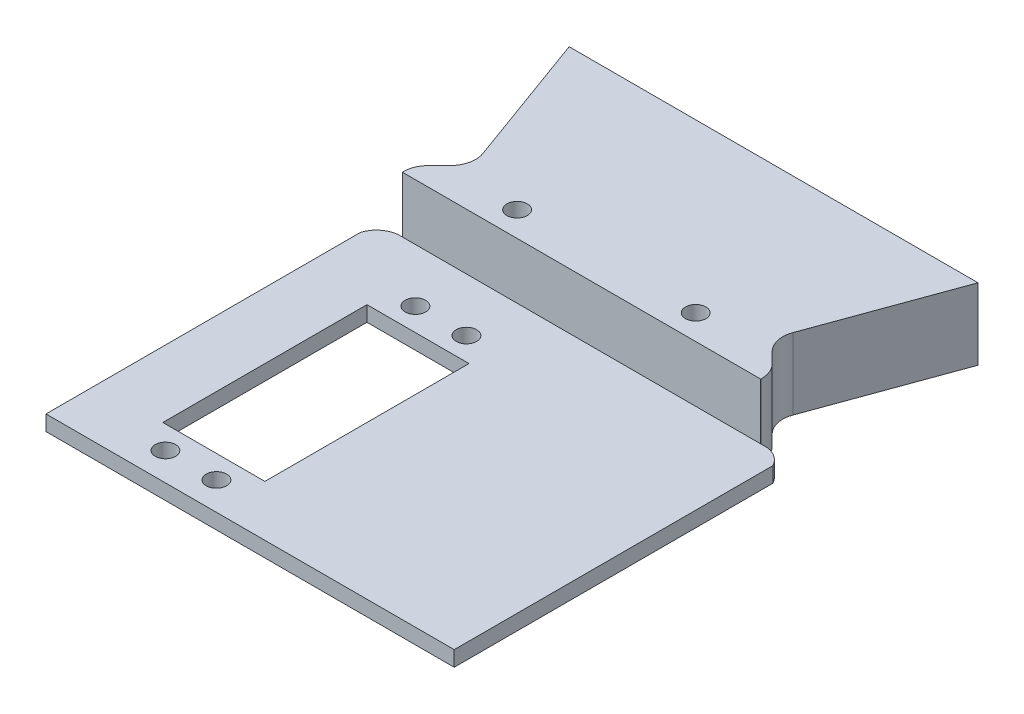
ISO-10303-21;
HEADER;
FILE_DESCRIPTION(('STEP AP214'),'2;1');
FILE_NAME('part.step','',(''),(''),'','','');
FILE_SCHEMA(('AUTOMOTIVE_DESIGN { 1 0 10303 214 1 1 1 1 }'));
ENDSEC;
DATA;
#1=APPLICATION_CONTEXT('core data for automotive mechanical design processes');
#2=APPLICATION_PROTOCOL_DEFINITION('international standard','automotive_design',2000,#1);
#3=PRODUCT_CONTEXT('',#1,'mechanical');
#4=PRODUCT('Part','Part','',(#3));
#5=PRODUCT_RELATED_PRODUCT_CATEGORY('part','',(#4));
#6=PRODUCT_DEFINITION_FORMATION('','',#4);
#7=PRODUCT_DEFINITION_CONTEXT('part definition',#1,'design');
#8=PRODUCT_DEFINITION('design','',#6,#7);
#9=PRODUCT_DEFINITION_SHAPE('','',#8);
#10=(LENGTH_UNIT() NAMED_UNIT(*) SI_UNIT(.MILLI.,.METRE.));
#11=(NAMED_UNIT(*) PLANE_ANGLE_UNIT() SI_UNIT($,.RADIAN.));
#12=(NAMED_UNIT(*) SI_UNIT($,.STERADIAN.) SOLID_ANGLE_UNIT());
#13=UNCERTAINTY_MEASURE_WITH_UNIT(LENGTH_MEASURE(1.E-05),#10,'distance_accuracy_value','');
#14=(GEOMETRIC_REPRESENTATION_CONTEXT(3) GLOBAL_UNCERTAINTY_ASSIGNED_CONTEXT((#13)) GLOBAL_UNIT_ASSIGNED_CONTEXT((#10,
#11,#12)) REPRESENTATION_CONTEXT('',''));
#15=CARTESIAN_POINT('',(0.,0.,0.));
#16=DIRECTION('',(0.,0.,1.));
#17=DIRECTION('',(1.,0.,0.));
#18=AXIS2_PLACEMENT_3D('',#15,#16,#17);
#19=CARTESIAN_POINT('',(30.122595971685,3.,4.7121872664304));
#20=DIRECTION('',(0.,1.,0.));
#21=DIRECTION('',(0.,0.,1.));
#22=AXIS2_PLACEMENT_3D('',#19,#20,#21);
#23=PLANE('',#22);
#24=CARTESIAN_POINT('',(-12.1,3.,64.3307254093344));
#25=DIRECTION('',(0.,1.,0.));
#26=DIRECTION('',(0.,0.,1.));
#27=AXIS2_PLACEMENT_3D('',#24,#25,#26);
#28=CIRCLE('',#27,2.);
#29=CARTESIAN_POINT('',(-12.1,3.,66.3307254093344));
#30=VERTEX_POINT('',#29);
#31=EDGE_CURVE('E498',#30,#30,#28,.F.);
#32=ORIENTED_EDGE('',*,*,#31,.T.);
#33=EDGE_LOOP('',(#32));
#34=FACE_BOUND('',#33,.T.);
#35=CARTESIAN_POINT('',(-22.1,3.,15.3307254093344));
#36=DIRECTION('',(0.,1.,0.));
#37=DIRECTION('',(0.,0.,1.));
#38=AXIS2_PLACEMENT_3D('',#35,#36,#37);
#39=CIRCLE('',#38,2.);
#40=CARTESIAN_POINT('',(-22.1,3.,17.3307254093344));
#41=VERTEX_POINT('',#40);
#42=EDGE_CURVE('E476',#41,#41,#39,.T.);
#43=ORIENTED_EDGE('',*,*,#42,.F.);
#44=EDGE_LOOP('',(#43));
#45=FACE_BOUND('',#44,.T.);
#46=DIRECTION('',(1.,0.,0.));
#47=VECTOR('',#46,1.);
#48=CARTESIAN_POINT('',(0.,3.,4.87726367456555));
#49=LINE('',#48,#47);
#50=CARTESIAN_POINT('',(-35.122595971685,3.,4.87726367456555));
#51=VERTEX_POINT('',#50);
#52=CARTESIAN_POINT('',(35.122595971685,3.,4.87726367456555));
#53=VERTEX_POINT('',#52);
#54=EDGE_CURVE('E256',#51,#53,#49,.T.);
#55=ORIENTED_EDGE('',*,*,#54,.F.);
#56=DIRECTION('',(-1.,0.,0.));
#57=VECTOR('',#56,1.);
#58=CARTESIAN_POINT('',(-40.,3.,4.87726367456555));
#59=LINE('',#58,#57);
#60=CARTESIAN_POINT('',(-35.8667204385013,3.,4.87726367456555));
#61=VERTEX_POINT('',#60);
#62=EDGE_CURVE('E355',#51,#61,#59,.T.);
#63=ORIENTED_EDGE('',*,*,#62,.T.);
#64=CARTESIAN_POINT('',(-35.4946582050931,3.,9.56251390208503));
#65=DIRECTION('',(0.,1.,0.));
#66=DIRECTION('',(0.,0.,1.));
#67=AXIS2_PLACEMENT_3D('',#64,#65,#66);
#68=CIRCLE('',#67,4.7);
#69=CARTESIAN_POINT('',(-40.,3.,8.2238969624547));
#70=VERTEX_POINT('',#69);
#71=EDGE_CURVE('E323',#61,#70,#68,.T.);
#72=ORIENTED_EDGE('',*,*,#71,.T.);
#73=DIRECTION('',(0.,0.,1.));
#74=VECTOR('',#73,1.);
#75=CARTESIAN_POINT('',(-40.,3.,36.0007254093344));
#76=LINE('',#75,#74);
#77=CARTESIAN_POINT('',(-40.,3.,69.8307254093344));
#78=VERTEX_POINT('',#77);
#79=EDGE_CURVE('E360',#70,#78,#76,.T.);
#80=ORIENTED_EDGE('',*,*,#79,.T.);
#81=DIRECTION('',(-1.,0.,0.));
#82=VECTOR('',#81,1.);
#83=CARTESIAN_POINT('',(-40.,3.,69.8307254093344));
#84=LINE('',#83,#82);
#85=CARTESIAN_POINT('',(40.002595971685,3.,69.8307254093344));
#86=VERTEX_POINT('',#85);
#87=EDGE_CURVE('E252',#86,#78,#84,.T.);
#88=ORIENTED_EDGE('',*,*,#87,.F.);
#89=DIRECTION('',(0.,0.,-1.));
#90=VECTOR('',#89,1.);
#91=CARTESIAN_POINT('',(40.002595971685,3.,4.87726367456555));
#92=LINE('',#91,#90);
#93=CARTESIAN_POINT('',(40.002595971685,3.,7.39589377408765));
#94=VERTEX_POINT('',#93);
#95=EDGE_CURVE('E351',#86,#94,#92,.T.);
#96=ORIENTED_EDGE('',*,*,#95,.T.);
#97=CARTESIAN_POINT('',(35.8131392673735,3.,9.5262581848634));
#98=DIRECTION('',(0.,1.,0.));
#99=DIRECTION('',(0.,0.,1.));
#100=AXIS2_PLACEMENT_3D('',#97,#98,#99);
#101=CIRCLE('',#100,4.7);
#102=CARTESIAN_POINT('',(36.5036825630621,3.,4.87726367456555));
#103=VERTEX_POINT('',#102);
#104=EDGE_CURVE('E341',#103,#94,#101,.F.);
#105=ORIENTED_EDGE('',*,*,#104,.F.);
#106=EDGE_CURVE('E359',#103,#53,#59,.T.);
#107=ORIENTED_EDGE('',*,*,#106,.T.);
#108=EDGE_LOOP('',(#55,#63,#72,#80,#88,#96,#105,#107));
#109=FACE_BOUND('',#108,.T.);
#110=DIRECTION('',(0.,0.,-1.));
#111=VECTOR('',#110,1.);
#112=CARTESIAN_POINT('',(-27.1,3.,0.));
#113=LINE('',#112,#111);
#114=CARTESIAN_POINT('',(-27.1,3.,59.8307254093344));
#115=VERTEX_POINT('',#114);
#116=CARTESIAN_POINT('',(-27.1,3.,19.8307254093344));
#117=VERTEX_POINT('',#116);
#118=EDGE_CURVE('E219',#115,#117,#113,.T.);
#119=ORIENTED_EDGE('',*,*,#118,.T.);
#120=DIRECTION('',(1.,0.,0.));
#121=VECTOR('',#120,1.);
#122=CARTESIAN_POINT('',(0.,3.,19.8307254093344));
#123=LINE('',#122,#121);
#124=CARTESIAN_POINT('',(-7.09999999999998,3.,19.8307254093344));
#125=VERTEX_POINT('',#124);
#126=EDGE_CURVE('E67',#117,#125,#123,.T.);
#127=ORIENTED_EDGE('',*,*,#126,.T.);
#128=DIRECTION('',(0.,0.,-1.));
#129=VECTOR('',#128,1.);
#130=CARTESIAN_POINT('',(-7.09999999999998,3.,0.));
#131=LINE('',#130,#129);
#132=CARTESIAN_POINT('',(-7.09999999999998,3.,59.8307254093344));
#133=VERTEX_POINT('',#132);
#134=EDGE_CURVE('E226',#133,#125,#131,.T.);
#135=ORIENTED_EDGE('',*,*,#134,.F.);
#136=DIRECTION('',(-1.,0.,0.));
#137=VECTOR('',#136,1.);
#138=CARTESIAN_POINT('',(8.3031811161835E-13,3.,59.830725409334));
#139=LINE('',#138,#137);
#140=EDGE_CURVE('E209',#133,#115,#139,.T.);
#141=ORIENTED_EDGE('',*,*,#140,.T.);
#142=EDGE_LOOP('',(#119,#127,#135,#141));
#143=FACE_BOUND('',#142,.T.);
#144=CARTESIAN_POINT('',(-22.1,3.,64.3307254093344));
#145=DIRECTION('',(0.,1.,0.));
#146=DIRECTION('',(0.,0.,1.));
#147=AXIS2_PLACEMENT_3D('',#144,#145,#146);
#148=CIRCLE('',#147,2.);
#149=CARTESIAN_POINT('',(-22.1,3.,66.3307254093344));
#150=VERTEX_POINT('',#149);
#151=EDGE_CURVE('E494',#150,#150,#148,.T.);
#152=ORIENTED_EDGE('',*,*,#151,.F.);
#153=EDGE_LOOP('',(#152));
#154=FACE_BOUND('',#153,.T.);
#155=CARTESIAN_POINT('',(-12.1,3.,15.3307254093344));
#156=DIRECTION('',(0.,1.,0.));
#157=DIRECTION('',(0.,0.,1.));
#158=AXIS2_PLACEMENT_3D('',#155,#156,#157);
#159=CIRCLE('',#158,2.);
#160=CARTESIAN_POINT('',(-12.1,3.,17.3307254093344));
#161=VERTEX_POINT('',#160);
#162=EDGE_CURVE('E493',#161,#161,#159,.F.);
#163=ORIENTED_EDGE('',*,*,#162,.T.);
#164=EDGE_LOOP('',(#163));
#165=FACE_BOUND('',#164,.T.);
#166=ADVANCED_FACE('F49',(#34,#45,#109,#143,#154,#165),#23,.T.);
#167=CARTESIAN_POINT('',(30.122595971685,0.,4.7121872664304));
#168=DIRECTION('',(0.,1.,0.));
#169=DIRECTION('',(0.,0.,1.));
#170=AXIS2_PLACEMENT_3D('',#167,#168,#169);
#171=PLANE('',#170);
#172=CARTESIAN_POINT('',(-22.1,0.,64.3307254093344));
#173=DIRECTION('',(0.,1.,0.));
#174=DIRECTION('',(0.,0.,1.));
#175=AXIS2_PLACEMENT_3D('',#172,#173,#174);
#176=CIRCLE('',#175,2.);
#177=CARTESIAN_POINT('',(-22.1,0.,66.3307254093344));
#178=VERTEX_POINT('',#177);
#179=EDGE_CURVE('E479',#178,#178,#176,.T.);
#180=ORIENTED_EDGE('',*,*,#179,.T.);
#181=EDGE_LOOP('',(#180));
#182=FACE_BOUND('',#181,.T.);
#183=CARTESIAN_POINT('',(-22.1,0.,15.3307254093344));
#184=DIRECTION('',(0.,1.,0.));
#185=DIRECTION('',(0.,0.,1.));
#186=AXIS2_PLACEMENT_3D('',#183,#184,#185);
#187=CIRCLE('',#186,2.);
#188=CARTESIAN_POINT('',(-22.1,0.,17.3307254093344));
#189=VERTEX_POINT('',#188);
#190=EDGE_CURVE('E471',#189,#189,#187,.T.);
#191=ORIENTED_EDGE('',*,*,#190,.T.);
#192=EDGE_LOOP('',(#191));
#193=FACE_BOUND('',#192,.T.);
#194=CARTESIAN_POINT('',(-35.4946582050931,0.,9.56251390208503));
#195=DIRECTION('',(0.,1.,0.));
#196=DIRECTION('',(0.,0.,1.));
#197=AXIS2_PLACEMENT_3D('',#194,#195,#196);
#198=CIRCLE('',#197,4.7);
#199=CARTESIAN_POINT('',(-35.8667204385013,0.,4.87726367456555));
#200=VERTEX_POINT('',#199);
#201=CARTESIAN_POINT('',(-40.,0.,8.2238969624547));
#202=VERTEX_POINT('',#201);
#203=EDGE_CURVE('E331',#200,#202,#198,.T.);
#204=ORIENTED_EDGE('',*,*,#203,.F.);
#205=DIRECTION('',(1.,0.,0.));
#206=VECTOR('',#205,1.);
#207=CARTESIAN_POINT('',(-40.,0.,4.87726367456555));
#208=LINE('',#207,#206);
#209=CARTESIAN_POINT('',(-35.122595971685,0.,4.87726367456555));
#210=VERTEX_POINT('',#209);
#211=EDGE_CURVE('E342',#200,#210,#208,.T.);
#212=ORIENTED_EDGE('',*,*,#211,.T.);
#213=DIRECTION('',(0.,0.,1.));
#214=VECTOR('',#213,1.);
#215=CARTESIAN_POINT('',(-35.122595971685,0.,23.3107254093344));
#216=LINE('',#215,#214);
#217=CARTESIAN_POINT('',(-35.122595971685,0.,4.7121872664304));
#218=VERTEX_POINT('',#217);
#219=EDGE_CURVE('E404',#218,#210,#216,.T.);
#220=ORIENTED_EDGE('',*,*,#219,.F.);
#221=CARTESIAN_POINT('',(-30.122595971685,0.,4.7121872664304));
#222=DIRECTION('',(0.,1.,0.));
#223=DIRECTION('',(0.,0.,-1.));
#224=AXIS2_PLACEMENT_3D('',#221,#222,#223);
#225=CIRCLE('',#224,5.);
#226=CARTESIAN_POINT('',(-33.6581298776177,0.,1.17665336049766));
#227=VERTEX_POINT('',#226);
#228=EDGE_CURVE('E401',#227,#218,#225,.T.);
#229=ORIENTED_EDGE('',*,*,#228,.F.);
#230=DIRECTION('',(-0.707106781186547,0.,0.707106781186548));
#231=VECTOR('',#230,1.);
#232=CARTESIAN_POINT('',(-33.6581298776177,0.,1.17665336049766));
#233=LINE('',#232,#231);
#234=CARTESIAN_POINT('',(-31.552193238004,0.,-0.929283279116098));
#235=VERTEX_POINT('',#234);
#236=EDGE_CURVE('E398',#235,#227,#233,.T.);
#237=ORIENTED_EDGE('',*,*,#236,.F.);
#238=CARTESIAN_POINT('',(-35.0877271439367,0.,-4.46481718504882));
#239=DIRECTION('',(0.,-1.,0.));
#240=DIRECTION('',(0.,0.,1.));
#241=AXIS2_PLACEMENT_3D('',#238,#239,#240);
#242=CIRCLE('',#241,4.99999999999999);
#243=CARTESIAN_POINT('',(-30.3892640400072,0.,-6.17491790167718));
#244=VERTEX_POINT('',#243);
#245=EDGE_CURVE('E395',#244,#235,#242,.T.);
#246=ORIENTED_EDGE('',*,*,#245,.F.);
#247=DIRECTION('',(0.342020143325672,0.,0.939692620785907));
#248=VECTOR('',#247,1.);
#249=CARTESIAN_POINT('',(-30.3892640400072,0.,-6.17491790167718));
#250=LINE('',#249,#248);
#251=CARTESIAN_POINT('',(-40.0654484737314,0.,-32.7600161398125));
#252=VERTEX_POINT('',#251);
#253=EDGE_CURVE('E392',#252,#244,#250,.T.);
#254=ORIENTED_EDGE('',*,*,#253,.F.);
#255=DIRECTION('',(-1.,0.,0.));
#256=VECTOR('',#255,1.);
#257=CARTESIAN_POINT('',(-40.0654484737314,0.,-32.7600161398125));
#258=LINE('',#257,#256);
#259=CARTESIAN_POINT('',(40.0654484737314,0.,-32.7600161398125));
#260=VERTEX_POINT('',#259);
#261=EDGE_CURVE('E389',#260,#252,#258,.T.);
#262=ORIENTED_EDGE('',*,*,#261,.F.);
#263=DIRECTION('',(0.342020143325672,0.,-0.939692620785907));
#264=VECTOR('',#263,1.);
#265=CARTESIAN_POINT('',(40.0654484737314,0.,-32.7600161398125));
#266=LINE('',#265,#264);
#267=CARTESIAN_POINT('',(30.3892640400072,0.,-6.17491790167718));
#268=VERTEX_POINT('',#267);
#269=EDGE_CURVE('E386',#268,#260,#266,.T.);
#270=ORIENTED_EDGE('',*,*,#269,.F.);
#271=CARTESIAN_POINT('',(35.0877271439367,0.,-4.46481718504882));
#272=DIRECTION('',(0.,-1.,0.));
#273=DIRECTION('',(0.,0.,-1.));
#274=AXIS2_PLACEMENT_3D('',#271,#272,#273);
#275=CIRCLE('',#274,5.);
#276=CARTESIAN_POINT('',(31.552193238004,0.,-0.929283279116095));
#277=VERTEX_POINT('',#276);
#278=EDGE_CURVE('E383',#277,#268,#275,.T.);
#279=ORIENTED_EDGE('',*,*,#278,.F.);
#280=DIRECTION('',(-0.707106781186545,0.,-0.707106781186549));
#281=VECTOR('',#280,1.);
#282=CARTESIAN_POINT('',(33.6581298776177,0.,1.17665336049767));
#283=LINE('',#282,#281);
#284=CARTESIAN_POINT('',(33.6581298776177,0.,1.17665336049767));
#285=VERTEX_POINT('',#284);
#286=EDGE_CURVE('E380',#285,#277,#283,.T.);
#287=ORIENTED_EDGE('',*,*,#286,.F.);
#288=CARTESIAN_POINT('',(30.122595971685,0.,4.7121872664304));
#289=DIRECTION('',(0.,1.,0.));
#290=DIRECTION('',(0.,0.,1.));
#291=AXIS2_PLACEMENT_3D('',#288,#289,#290);
#292=CIRCLE('',#291,5.);
#293=CARTESIAN_POINT('',(35.122595971685,0.,4.7121872664304));
#294=VERTEX_POINT('',#293);
#295=EDGE_CURVE('E376',#294,#285,#292,.T.);
#296=ORIENTED_EDGE('',*,*,#295,.F.);
#297=DIRECTION('',(0.,0.,-1.));
#298=VECTOR('',#297,1.);
#299=CARTESIAN_POINT('',(35.122595971685,0.,23.3107254093344));
#300=LINE('',#299,#298);
#301=CARTESIAN_POINT('',(35.122595971685,0.,4.87726367456555));
#302=VERTEX_POINT('',#301);
#303=EDGE_CURVE('E373',#302,#294,#300,.T.);
#304=ORIENTED_EDGE('',*,*,#303,.F.);
#305=CARTESIAN_POINT('',(36.5036825630621,0.,4.87726367456555));
#306=VERTEX_POINT('',#305);
#307=EDGE_CURVE('E346',#302,#306,#208,.T.);
#308=ORIENTED_EDGE('',*,*,#307,.T.);
#309=CARTESIAN_POINT('',(35.8131392673735,0.,9.5262581848634));
#310=DIRECTION('',(0.,1.,0.));
#311=DIRECTION('',(0.,0.,1.));
#312=AXIS2_PLACEMENT_3D('',#309,#310,#311);
#313=CIRCLE('',#312,4.7);
#314=CARTESIAN_POINT('',(40.002595971685,0.,7.39589377408765));
#315=VERTEX_POINT('',#314);
#316=EDGE_CURVE('E337',#306,#315,#313,.F.);
#317=ORIENTED_EDGE('',*,*,#316,.T.);
#318=DIRECTION('',(0.,0.,1.));
#319=VECTOR('',#318,1.);
#320=CARTESIAN_POINT('',(40.002595971685,0.,4.87726367456555));
#321=LINE('',#320,#319);
#322=CARTESIAN_POINT('',(40.002595971685,0.,69.8307254093344));
#323=VERTEX_POINT('',#322);
#324=EDGE_CURVE('E350',#315,#323,#321,.T.);
#325=ORIENTED_EDGE('',*,*,#324,.T.);
#326=DIRECTION('',(1.,0.,0.));
#327=VECTOR('',#326,1.);
#328=CARTESIAN_POINT('',(-40.,0.,69.8307254093344));
#329=LINE('',#328,#327);
#330=CARTESIAN_POINT('',(-40.,0.,69.8307254093344));
#331=VERTEX_POINT('',#330);
#332=EDGE_CURVE('E244',#331,#323,#329,.T.);
#333=ORIENTED_EDGE('',*,*,#332,.F.);
#334=DIRECTION('',(0.,0.,-1.));
#335=VECTOR('',#334,1.);
#336=CARTESIAN_POINT('',(-40.,0.,36.0007254093344));
#337=LINE('',#336,#335);
#338=EDGE_CURVE('E345',#331,#202,#337,.T.);
#339=ORIENTED_EDGE('',*,*,#338,.T.);
#340=EDGE_LOOP('',(#204,#212,#220,#229,#237,#246,#254,#262,#270,#279,#287,#296,#304,#308,#317,
#325,#333,#339));
#341=FACE_BOUND('',#340,.T.);
#342=CARTESIAN_POINT('',(-17.5,0.,-1.61398125121055E-05));
#343=DIRECTION('',(0.,1.,0.));
#344=DIRECTION('',(0.,0.,1.));
#345=AXIS2_PLACEMENT_3D('',#342,#343,#344);
#346=CIRCLE('',#345,2.);
#347=CARTESIAN_POINT('',(-17.5,0.,1.99998386018749));
#348=VERTEX_POINT('',#347);
#349=EDGE_CURVE('E377',#348,#348,#346,.T.);
#350=ORIENTED_EDGE('',*,*,#349,.T.);
#351=EDGE_LOOP('',(#350));
#352=FACE_BOUND('',#351,.T.);
#353=CARTESIAN_POINT('',(17.5,0.,-1.61398125142487E-05));
#354=DIRECTION('',(0.,1.,0.));
#355=DIRECTION('',(0.,0.,1.));
#356=AXIS2_PLACEMENT_3D('',#353,#354,#355);
#357=CIRCLE('',#356,2.);
#358=CARTESIAN_POINT('',(17.5,0.,1.99998386018748));
#359=VERTEX_POINT('',#358);
#360=EDGE_CURVE('E372',#359,#359,#357,.T.);
#361=ORIENTED_EDGE('',*,*,#360,.T.);
#362=EDGE_LOOP('',(#361));
#363=FACE_BOUND('',#362,.T.);
#364=DIRECTION('',(1.,0.,0.));
#365=VECTOR('',#364,1.);
#366=CARTESIAN_POINT('',(30.122595971685,0.,19.8307254093344));
#367=LINE('',#366,#365);
#368=CARTESIAN_POINT('',(-27.1,0.,19.8307254093344));
#369=VERTEX_POINT('',#368);
#370=CARTESIAN_POINT('',(-7.09999999999998,0.,19.8307254093344));
#371=VERTEX_POINT('',#370);
#372=EDGE_CURVE('E12',#369,#371,#367,.T.);
#373=ORIENTED_EDGE('',*,*,#372,.F.);
#374=DIRECTION('',(0.,0.,-1.));
#375=VECTOR('',#374,1.);
#376=CARTESIAN_POINT('',(-27.1,0.,4.7121872664304));
#377=LINE('',#376,#375);
#378=CARTESIAN_POINT('',(-27.1,0.,59.8307254093344));
#379=VERTEX_POINT('',#378);
#380=EDGE_CURVE('E463',#379,#369,#377,.T.);
#381=ORIENTED_EDGE('',*,*,#380,.F.);
#382=DIRECTION('',(-1.,0.,0.));
#383=VECTOR('',#382,1.);
#384=CARTESIAN_POINT('',(30.1225959716857,0.,59.8307254093336));
#385=LINE('',#384,#383);
#386=CARTESIAN_POINT('',(-7.09999999999998,0.,59.8307254093344));
#387=VERTEX_POINT('',#386);
#388=EDGE_CURVE('E212',#387,#379,#385,.T.);
#389=ORIENTED_EDGE('',*,*,#388,.F.);
#390=DIRECTION('',(0.,0.,-1.));
#391=VECTOR('',#390,1.);
#392=CARTESIAN_POINT('',(-7.09999999999998,0.,4.7121872664304));
#393=LINE('',#392,#391);
#394=EDGE_CURVE('E59',#387,#371,#393,.T.);
#395=ORIENTED_EDGE('',*,*,#394,.T.);
#396=EDGE_LOOP('',(#373,#381,#389,#395));
#397=FACE_BOUND('',#396,.T.);
#398=CARTESIAN_POINT('',(-12.1,0.,64.3307254093344));
#399=DIRECTION('',(0.,1.,0.));
#400=DIRECTION('',(0.,0.,1.));
#401=AXIS2_PLACEMENT_3D('',#398,#399,#400);
#402=CIRCLE('',#401,2.);
#403=CARTESIAN_POINT('',(-12.1,0.,66.3307254093344));
#404=VERTEX_POINT('',#403);
#405=EDGE_CURVE('E475',#404,#404,#402,.F.);
#406=ORIENTED_EDGE('',*,*,#405,.F.);
#407=EDGE_LOOP('',(#406));
#408=FACE_BOUND('',#407,.T.);
#409=CARTESIAN_POINT('',(-12.1,0.,15.3307254093344));
#410=DIRECTION('',(0.,1.,0.));
#411=DIRECTION('',(0.,0.,1.));
#412=AXIS2_PLACEMENT_3D('',#409,#410,#411);
#413=CIRCLE('',#412,2.);
#414=CARTESIAN_POINT('',(-12.1,0.,17.3307254093344));
#415=VERTEX_POINT('',#414);
#416=EDGE_CURVE('E53',#415,#415,#413,.F.);
#417=ORIENTED_EDGE('',*,*,#416,.F.);
#418=EDGE_LOOP('',(#417));
#419=FACE_BOUND('',#418,.T.);
#420=ADVANCED_FACE('F516',(#182,#193,#341,#352,#363,#397,#408,#419),#171,.F.);
#421=CARTESIAN_POINT('',(-40.,-85.8433761717483,4.87726367456555));
#422=DIRECTION('',(0.,0.,-1.));
#423=DIRECTION('',(-1.,0.,0.));
#424=AXIS2_PLACEMENT_3D('',#421,#422,#423);
#425=PLANE('',#424);
#426=ORIENTED_EDGE('',*,*,#211,.F.);
#427=DIRECTION('',(0.,1.,0.));
#428=VECTOR('',#427,1.);
#429=CARTESIAN_POINT('',(-35.8667204385013,-7.,4.87726367456555));
#430=LINE('',#429,#428);
#431=EDGE_CURVE('E327',#200,#61,#430,.T.);
#432=ORIENTED_EDGE('',*,*,#431,.T.);
#433=ORIENTED_EDGE('',*,*,#62,.F.);
#434=DIRECTION('',(0.,1.,0.));
#435=VECTOR('',#434,1.);
#436=CARTESIAN_POINT('',(-35.122595971685,3.,4.87726367456555));
#437=LINE('',#436,#435);
#438=EDGE_CURVE('E365',#210,#51,#437,.T.);
#439=ORIENTED_EDGE('',*,*,#438,.F.);
#440=EDGE_LOOP('',(#426,#432,#433,#439));
#441=FACE_BOUND('',#440,.T.);
#442=ADVANCED_FACE('F519',(#441),#425,.T.);
#443=CARTESIAN_POINT('',(-40.,-85.8433761717483,36.0007254093344));
#444=DIRECTION('',(-1.,0.,0.));
#445=DIRECTION('',(0.,0.,1.));
#446=AXIS2_PLACEMENT_3D('',#443,#444,#445);
#447=PLANE('',#446);
#448=ORIENTED_EDGE('',*,*,#79,.F.);
#449=DIRECTION('',(0.,1.,0.));
#450=VECTOR('',#449,1.);
#451=CARTESIAN_POINT('',(-40.,-7.,8.2238969624547));
#452=LINE('',#451,#450);
#453=EDGE_CURVE('E457',#70,#202,#452,.F.);
#454=ORIENTED_EDGE('',*,*,#453,.T.);
#455=ORIENTED_EDGE('',*,*,#338,.F.);
#456=DIRECTION('',(0.,-1.,0.));
#457=VECTOR('',#456,1.);
#458=CARTESIAN_POINT('',(-40.,3.,69.8307254093344));
#459=LINE('',#458,#457);
#460=EDGE_CURVE('E236',#78,#331,#459,.T.);
#461=ORIENTED_EDGE('',*,*,#460,.F.);
#462=EDGE_LOOP('',(#448,#454,#455,#461));
#463=FACE_BOUND('',#462,.T.);
#464=ADVANCED_FACE('F526',(#463),#447,.T.);
#465=CARTESIAN_POINT('',(35.122595971685,3.,23.3107254093344));
#466=DIRECTION('',(-1.,0.,0.));
#467=DIRECTION('',(0.,0.,1.));
#468=AXIS2_PLACEMENT_3D('',#465,#466,#467);
#469=PLANE('',#468);
#470=DIRECTION('',(0.,-1.,0.));
#471=VECTOR('',#470,1.);
#472=CARTESIAN_POINT('',(35.122595971685,3.,4.7121872664304));
#473=LINE('',#472,#471);
#474=CARTESIAN_POINT('',(35.122595971685,14.,4.7121872664304));
#475=VERTEX_POINT('',#474);
#476=EDGE_CURVE('E444',#475,#294,#473,.T.);
#477=ORIENTED_EDGE('',*,*,#476,.F.);
#478=DIRECTION('',(0.,0.,-1.));
#479=VECTOR('',#478,1.);
#480=CARTESIAN_POINT('',(35.122595971685,14.,0.));
#481=LINE('',#480,#479);
#482=CARTESIAN_POINT('',(35.122595971685,14.,4.87726367456555));
#483=VERTEX_POINT('',#482);
#484=EDGE_CURVE('E272',#483,#475,#481,.T.);
#485=ORIENTED_EDGE('',*,*,#484,.F.);
#486=DIRECTION('',(0.,-1.,0.));
#487=VECTOR('',#486,1.);
#488=CARTESIAN_POINT('',(35.122595971685,14.,4.87726367456555));
#489=LINE('',#488,#487);
#490=EDGE_CURVE('E312',#483,#53,#489,.T.);
#491=ORIENTED_EDGE('',*,*,#490,.T.);
#492=DIRECTION('',(0.,-1.,0.));
#493=VECTOR('',#492,1.);
#494=CARTESIAN_POINT('',(35.122595971685,3.,4.87726367456555));
#495=LINE('',#494,#493);
#496=EDGE_CURVE('E369',#53,#302,#495,.T.);
#497=ORIENTED_EDGE('',*,*,#496,.T.);
#498=ORIENTED_EDGE('',*,*,#303,.T.);
#499=EDGE_LOOP('',(#477,#485,#491,#497,#498));
#500=FACE_BOUND('',#499,.T.);
#501=ADVANCED_FACE('F51',(#500),#469,.F.);
#502=CARTESIAN_POINT('',(30.122595971685,3.,4.7121872664304));
#503=DIRECTION('',(0.,-1.,0.));
#504=DIRECTION('',(0.,0.,-1.));
#505=AXIS2_PLACEMENT_3D('',#502,#503,#504);
#506=CYLINDRICAL_SURFACE('',#505,5.);
#507=ORIENTED_EDGE('',*,*,#295,.T.);
#508=DIRECTION('',(0.,-1.,0.));
#509=VECTOR('',#508,1.);
#510=CARTESIAN_POINT('',(33.6581298776177,3.,1.17665336049767));
#511=LINE('',#510,#509);
#512=CARTESIAN_POINT('',(33.6581298776177,14.,1.17665336049768));
#513=VERTEX_POINT('',#512);
#514=EDGE_CURVE('E440',#513,#285,#511,.T.);
#515=ORIENTED_EDGE('',*,*,#514,.F.);
#516=CARTESIAN_POINT('',(30.122595971685,14.,4.7121872664304));
#517=DIRECTION('',(0.,1.,0.));
#518=DIRECTION('',(0.,0.,1.));
#519=AXIS2_PLACEMENT_3D('',#516,#517,#518);
#520=CIRCLE('',#519,5.);
#521=EDGE_CURVE('E276',#475,#513,#520,.T.);
#522=ORIENTED_EDGE('',*,*,#521,.F.);
#523=ORIENTED_EDGE('',*,*,#476,.T.);
#524=EDGE_LOOP('',(#507,#515,#522,#523));
#525=FACE_BOUND('',#524,.T.);
#526=ADVANCED_FACE('F569',(#525),#506,.T.);
#527=CARTESIAN_POINT('',(33.6581298776177,3.,1.17665336049767));
#528=DIRECTION('',(-0.70710678118655,0.,0.707106781186546));
#529=DIRECTION('',(0.707106781186546,0.,0.70710678118655));
#530=AXIS2_PLACEMENT_3D('',#527,#528,#529);
#531=PLANE('',#530);
#532=ORIENTED_EDGE('',*,*,#286,.T.);
#533=DIRECTION('',(0.,-1.,0.));
#534=VECTOR('',#533,1.);
#535=CARTESIAN_POINT('',(31.552193238004,3.,-0.929283279116095));
#536=LINE('',#535,#534);
#537=CARTESIAN_POINT('',(31.552193238004,14.,-0.929283279116096));
#538=VERTEX_POINT('',#537);
#539=EDGE_CURVE('E436',#538,#277,#536,.T.);
#540=ORIENTED_EDGE('',*,*,#539,.F.);
#541=DIRECTION('',(-0.707106781186546,0.,-0.707106781186549));
#542=VECTOR('',#541,1.);
#543=CARTESIAN_POINT('',(16.2407382585601,14.,-16.24073825856));
#544=LINE('',#543,#542);
#545=EDGE_CURVE('E280',#513,#538,#544,.T.);
#546=ORIENTED_EDGE('',*,*,#545,.F.);
#547=ORIENTED_EDGE('',*,*,#514,.T.);
#548=EDGE_LOOP('',(#532,#540,#546,#547));
#549=FACE_BOUND('',#548,.T.);
#550=ADVANCED_FACE('F566',(#549),#531,.F.);
#551=CARTESIAN_POINT('',(35.0877271439367,3.,-4.46481718504882));
#552=DIRECTION('',(0.,-1.,0.));
#553=DIRECTION('',(0.,0.,-1.));
#554=AXIS2_PLACEMENT_3D('',#551,#552,#553);
#555=CYLINDRICAL_SURFACE('',#554,5.);
#556=ORIENTED_EDGE('',*,*,#278,.T.);
#557=DIRECTION('',(0.,-1.,0.));
#558=VECTOR('',#557,1.);
#559=CARTESIAN_POINT('',(30.3892640400072,3.,-6.17491790167718));
#560=LINE('',#559,#558);
#561=CARTESIAN_POINT('',(30.3892640400072,14.,-6.17491790167719));
#562=VERTEX_POINT('',#561);
#563=EDGE_CURVE('E432',#562,#268,#560,.T.);
#564=ORIENTED_EDGE('',*,*,#563,.F.);
#565=CARTESIAN_POINT('',(35.0877271439367,14.,-4.46481718504882));
#566=DIRECTION('',(0.,1.,0.));
#567=DIRECTION('',(0.,0.,1.));
#568=AXIS2_PLACEMENT_3D('',#565,#566,#567);
#569=CIRCLE('',#568,5.);
#570=EDGE_CURVE('E284',#538,#562,#569,.F.);
#571=ORIENTED_EDGE('',*,*,#570,.F.);
#572=ORIENTED_EDGE('',*,*,#539,.T.);
#573=EDGE_LOOP('',(#556,#564,#571,#572));
#574=FACE_BOUND('',#573,.T.);
#575=ADVANCED_FACE('F562',(#574),#555,.F.);
#576=CARTESIAN_POINT('',(40.0654484737314,3.,-32.7600161398125));
#577=DIRECTION('',(-0.939692620785907,0.,-0.342020143325672));
#578=DIRECTION('',(-0.342020143325672,0.,0.939692620785907));
#579=AXIS2_PLACEMENT_3D('',#576,#577,#578);
#580=PLANE('',#579);
#581=ORIENTED_EDGE('',*,*,#269,.T.);
#582=DIRECTION('',(0.,-1.,0.));
#583=VECTOR('',#582,1.);
#584=CARTESIAN_POINT('',(40.0654484737314,3.,-32.7600161398125));
#585=LINE('',#584,#583);
#586=CARTESIAN_POINT('',(40.0654484737314,14.,-32.7600161398125));
#587=VERTEX_POINT('',#586);
#588=EDGE_CURVE('E428',#587,#260,#585,.T.);
#589=ORIENTED_EDGE('',*,*,#588,.F.);
#590=DIRECTION('',(0.342020143325672,0.,-0.939692620785907));
#591=VECTOR('',#590,1.);
#592=CARTESIAN_POINT('',(24.8498150851501,14.,9.04459301801398));
#593=LINE('',#592,#591);
#594=EDGE_CURVE('E288',#562,#587,#593,.T.);
#595=ORIENTED_EDGE('',*,*,#594,.F.);
#596=ORIENTED_EDGE('',*,*,#563,.T.);
#597=EDGE_LOOP('',(#581,#589,#595,#596));
#598=FACE_BOUND('',#597,.T.);
#599=ADVANCED_FACE('F558',(#598),#580,.F.);
#600=CARTESIAN_POINT('',(-40.0654484737314,3.,-32.7600161398125));
#601=DIRECTION('',(0.,0.,1.));
#602=DIRECTION('',(1.,0.,0.));
#603=AXIS2_PLACEMENT_3D('',#600,#601,#602);
#604=PLANE('',#603);
#605=ORIENTED_EDGE('',*,*,#261,.T.);
#606=DIRECTION('',(0.,-1.,0.));
#607=VECTOR('',#606,1.);
#608=CARTESIAN_POINT('',(-40.0654484737314,3.,-32.7600161398125));
#609=LINE('',#608,#607);
#610=CARTESIAN_POINT('',(-40.0654484737314,14.,-32.7600161398125));
#611=VERTEX_POINT('',#610);
#612=EDGE_CURVE('E424',#611,#252,#609,.T.);
#613=ORIENTED_EDGE('',*,*,#612,.F.);
#614=DIRECTION('',(-1.,0.,0.));
#615=VECTOR('',#614,1.);
#616=CARTESIAN_POINT('',(0.,14.,-32.7600161398125));
#617=LINE('',#616,#615);
#618=EDGE_CURVE('E292',#587,#611,#617,.T.);
#619=ORIENTED_EDGE('',*,*,#618,.F.);
#620=ORIENTED_EDGE('',*,*,#588,.T.);
#621=EDGE_LOOP('',(#605,#613,#619,#620));
#622=FACE_BOUND('',#621,.T.);
#623=ADVANCED_FACE('F554',(#622),#604,.F.);
#624=CARTESIAN_POINT('',(-30.3892640400072,3.,-6.17491790167718));
#625=DIRECTION('',(0.939692620785907,0.,-0.342020143325672));
#626=DIRECTION('',(-0.342020143325672,0.,-0.939692620785907));
#627=AXIS2_PLACEMENT_3D('',#624,#625,#626);
#628=PLANE('',#627);
#629=ORIENTED_EDGE('',*,*,#253,.T.);
#630=DIRECTION('',(0.,-1.,0.));
#631=VECTOR('',#630,1.);
#632=CARTESIAN_POINT('',(-30.3892640400072,3.,-6.17491790167718));
#633=LINE('',#632,#631);
#634=CARTESIAN_POINT('',(-30.3892640400072,14.,-6.17491790167718));
#635=VERTEX_POINT('',#634);
#636=EDGE_CURVE('E420',#635,#244,#633,.T.);
#637=ORIENTED_EDGE('',*,*,#636,.F.);
#638=DIRECTION('',(0.342020143325672,0.,0.939692620785907));
#639=VECTOR('',#638,1.);
#640=CARTESIAN_POINT('',(-24.8498150851501,14.,9.04459301801399));
#641=LINE('',#640,#639);
#642=EDGE_CURVE('E296',#611,#635,#641,.T.);
#643=ORIENTED_EDGE('',*,*,#642,.F.);
#644=ORIENTED_EDGE('',*,*,#612,.T.);
#645=EDGE_LOOP('',(#629,#637,#643,#644));
#646=FACE_BOUND('',#645,.T.);
#647=ADVANCED_FACE('F550',(#646),#628,.F.);
#648=CARTESIAN_POINT('',(-35.0877271439367,3.,-4.46481718504882));
#649=DIRECTION('',(0.,-1.,0.));
#650=DIRECTION('',(0.,0.,-1.));
#651=AXIS2_PLACEMENT_3D('',#648,#649,#650);
#652=CYLINDRICAL_SURFACE('',#651,4.99999999999999);
#653=ORIENTED_EDGE('',*,*,#245,.T.);
#654=DIRECTION('',(0.,-1.,0.));
#655=VECTOR('',#654,1.);
#656=CARTESIAN_POINT('',(-31.552193238004,3.,-0.929283279116098));
#657=LINE('',#656,#655);
#658=CARTESIAN_POINT('',(-31.552193238004,14.,-0.929283279116098));
#659=VERTEX_POINT('',#658);
#660=EDGE_CURVE('E416',#659,#235,#657,.T.);
#661=ORIENTED_EDGE('',*,*,#660,.F.);
#662=CARTESIAN_POINT('',(-35.0877271439367,14.,-4.46481718504882));
#663=DIRECTION('',(0.,1.,0.));
#664=DIRECTION('',(0.,0.,1.));
#665=AXIS2_PLACEMENT_3D('',#662,#663,#664);
#666=CIRCLE('',#665,4.99999999999999);
#667=EDGE_CURVE('E300',#635,#659,#666,.F.);
#668=ORIENTED_EDGE('',*,*,#667,.F.);
#669=ORIENTED_EDGE('',*,*,#636,.T.);
#670=EDGE_LOOP('',(#653,#661,#668,#669));
#671=FACE_BOUND('',#670,.T.);
#672=ADVANCED_FACE('F546',(#671),#652,.F.);
#673=CARTESIAN_POINT('',(-33.6581298776177,3.,1.17665336049766));
#674=DIRECTION('',(0.707106781186548,0.,0.707106781186547));
#675=DIRECTION('',(0.707106781186547,0.,-0.707106781186548));
#676=AXIS2_PLACEMENT_3D('',#673,#674,#675);
#677=PLANE('',#676);
#678=ORIENTED_EDGE('',*,*,#236,.T.);
#679=DIRECTION('',(0.,-1.,0.));
#680=VECTOR('',#679,1.);
#681=CARTESIAN_POINT('',(-33.6581298776177,3.,1.17665336049766));
#682=LINE('',#681,#680);
#683=CARTESIAN_POINT('',(-33.6581298776177,14.,1.17665336049767));
#684=VERTEX_POINT('',#683);
#685=EDGE_CURVE('E412',#684,#227,#682,.T.);
#686=ORIENTED_EDGE('',*,*,#685,.F.);
#687=DIRECTION('',(-0.707106781186547,0.,0.707106781186548));
#688=VECTOR('',#687,1.);
#689=CARTESIAN_POINT('',(-16.2407382585601,14.,-16.24073825856));
#690=LINE('',#689,#688);
#691=EDGE_CURVE('E304',#659,#684,#690,.T.);
#692=ORIENTED_EDGE('',*,*,#691,.F.);
#693=ORIENTED_EDGE('',*,*,#660,.T.);
#694=EDGE_LOOP('',(#678,#686,#692,#693));
#695=FACE_BOUND('',#694,.T.);
#696=ADVANCED_FACE('F542',(#695),#677,.F.);
#697=CARTESIAN_POINT('',(-30.122595971685,3.,4.7121872664304));
#698=DIRECTION('',(0.,-1.,0.));
#699=DIRECTION('',(0.,0.,-1.));
#700=AXIS2_PLACEMENT_3D('',#697,#698,#699);
#701=CYLINDRICAL_SURFACE('',#700,5.);
#702=ORIENTED_EDGE('',*,*,#228,.T.);
#703=DIRECTION('',(0.,-1.,0.));
#704=VECTOR('',#703,1.);
#705=CARTESIAN_POINT('',(-35.122595971685,3.,4.7121872664304));
#706=LINE('',#705,#704);
#707=CARTESIAN_POINT('',(-35.122595971685,14.,4.7121872664304));
#708=VERTEX_POINT('',#707);
#709=EDGE_CURVE('E408',#708,#218,#706,.T.);
#710=ORIENTED_EDGE('',*,*,#709,.F.);
#711=CARTESIAN_POINT('',(-30.122595971685,14.,4.7121872664304));
#712=DIRECTION('',(0.,1.,0.));
#713=DIRECTION('',(0.,0.,1.));
#714=AXIS2_PLACEMENT_3D('',#711,#712,#713);
#715=CIRCLE('',#714,5.);
#716=EDGE_CURVE('E308',#684,#708,#715,.T.);
#717=ORIENTED_EDGE('',*,*,#716,.F.);
#718=ORIENTED_EDGE('',*,*,#685,.T.);
#719=EDGE_LOOP('',(#702,#710,#717,#718));
#720=FACE_BOUND('',#719,.T.);
#721=ADVANCED_FACE('F538',(#720),#701,.T.);
#722=CARTESIAN_POINT('',(-35.122595971685,3.,23.3107254093344));
#723=DIRECTION('',(1.,0.,0.));
#724=DIRECTION('',(0.,0.,-1.));
#725=AXIS2_PLACEMENT_3D('',#722,#723,#724);
#726=PLANE('',#725);
#727=ORIENTED_EDGE('',*,*,#219,.T.);
#728=ORIENTED_EDGE('',*,*,#438,.T.);
#729=DIRECTION('',(0.,-1.,0.));
#730=VECTOR('',#729,1.);
#731=CARTESIAN_POINT('',(-35.122595971685,14.,4.87726367456555));
#732=LINE('',#731,#730);
#733=CARTESIAN_POINT('',(-35.122595971685,14.,4.87726367456555));
#734=VERTEX_POINT('',#733);
#735=EDGE_CURVE('E319',#734,#51,#732,.T.);
#736=ORIENTED_EDGE('',*,*,#735,.F.);
#737=DIRECTION('',(0.,0.,1.));
#738=VECTOR('',#737,1.);
#739=CARTESIAN_POINT('',(-35.122595971685,14.,0.));
#740=LINE('',#739,#738);
#741=EDGE_CURVE('E265',#708,#734,#740,.T.);
#742=ORIENTED_EDGE('',*,*,#741,.F.);
#743=ORIENTED_EDGE('',*,*,#709,.T.);
#744=EDGE_LOOP('',(#727,#728,#736,#742,#743));
#745=FACE_BOUND('',#744,.T.);
#746=ADVANCED_FACE('F534',(#745),#726,.F.);
#747=CARTESIAN_POINT('',(17.5,-7.,-1.61398125142487E-05));
#748=DIRECTION('',(0.,1.,0.));
#749=DIRECTION('',(0.,0.,1.));
#750=AXIS2_PLACEMENT_3D('',#747,#748,#749);
#751=CYLINDRICAL_SURFACE('',#750,2.);
#752=ORIENTED_EDGE('',*,*,#360,.F.);
#753=EDGE_LOOP('',(#752));
#754=FACE_BOUND('',#753,.T.);
#755=CARTESIAN_POINT('',(17.5,14.,-1.61398125142487E-05));
#756=DIRECTION('',(0.,1.,0.));
#757=DIRECTION('',(0.,0.,1.));
#758=AXIS2_PLACEMENT_3D('',#755,#756,#757);
#759=CIRCLE('',#758,2.);
#760=CARTESIAN_POINT('',(17.5,14.,1.99998386018748));
#761=VERTEX_POINT('',#760);
#762=EDGE_CURVE('E261',#761,#761,#759,.F.);
#763=ORIENTED_EDGE('',*,*,#762,.F.);
#764=EDGE_LOOP('',(#763));
#765=FACE_BOUND('',#764,.T.);
#766=ADVANCED_FACE('F537',(#754,#765),#751,.F.);
#767=CARTESIAN_POINT('',(-17.5,-7.,-1.61398125121055E-05));
#768=DIRECTION('',(0.,1.,0.));
#769=DIRECTION('',(0.,0.,1.));
#770=AXIS2_PLACEMENT_3D('',#767,#768,#769);
#771=CYLINDRICAL_SURFACE('',#770,2.);
#772=ORIENTED_EDGE('',*,*,#349,.F.);
#773=EDGE_LOOP('',(#772));
#774=FACE_BOUND('',#773,.T.);
#775=CARTESIAN_POINT('',(-17.5,14.,-1.61398125121055E-05));
#776=DIRECTION('',(0.,1.,0.));
#777=DIRECTION('',(0.,0.,1.));
#778=AXIS2_PLACEMENT_3D('',#775,#776,#777);
#779=CIRCLE('',#778,2.);
#780=CARTESIAN_POINT('',(-17.5,14.,1.99998386018749));
#781=VERTEX_POINT('',#780);
#782=EDGE_CURVE('E257',#781,#781,#779,.F.);
#783=ORIENTED_EDGE('',*,*,#782,.F.);
#784=EDGE_LOOP('',(#783));
#785=FACE_BOUND('',#784,.T.);
#786=ADVANCED_FACE('F650',(#774,#785),#771,.F.);
#787=DIRECTION('',(0.,1.,0.));
#788=VECTOR('',#787,1.);
#789=CARTESIAN_POINT('',(36.5036825630621,-7.,4.87726367456555));
#790=LINE('',#789,#788);
#791=EDGE_CURVE('E334',#306,#103,#790,.T.);
#792=ORIENTED_EDGE('',*,*,#791,.F.);
#793=ORIENTED_EDGE('',*,*,#307,.F.);
#794=ORIENTED_EDGE('',*,*,#496,.F.);
#795=ORIENTED_EDGE('',*,*,#106,.F.);
#796=EDGE_LOOP('',(#792,#793,#794,#795));
#797=FACE_BOUND('',#796,.T.);
#798=ADVANCED_FACE('F529',(#797),#425,.T.);
#799=CARTESIAN_POINT('',(40.002595971685,-85.8433761717483,4.87726367456555));
#800=DIRECTION('',(1.,0.,0.));
#801=DIRECTION('',(0.,0.,-1.));
#802=AXIS2_PLACEMENT_3D('',#799,#800,#801);
#803=PLANE('',#802);
#804=DIRECTION('',(0.,1.,0.));
#805=VECTOR('',#804,1.);
#806=CARTESIAN_POINT('',(40.002595971685,-7.,7.39589377408765));
#807=LINE('',#806,#805);
#808=EDGE_CURVE('E448',#94,#315,#807,.F.);
#809=ORIENTED_EDGE('',*,*,#808,.F.);
#810=ORIENTED_EDGE('',*,*,#95,.F.);
#811=DIRECTION('',(0.,1.,0.));
#812=VECTOR('',#811,1.);
#813=CARTESIAN_POINT('',(40.002595971685,3.,69.8307254093344));
#814=LINE('',#813,#812);
#815=EDGE_CURVE('E248',#323,#86,#814,.T.);
#816=ORIENTED_EDGE('',*,*,#815,.F.);
#817=ORIENTED_EDGE('',*,*,#324,.F.);
#818=EDGE_LOOP('',(#809,#810,#816,#817));
#819=FACE_BOUND('',#818,.T.);
#820=ADVANCED_FACE('F627',(#819),#803,.T.);
#821=CARTESIAN_POINT('',(35.8131392673735,-7.,9.5262581848634));
#822=DIRECTION('',(0.,1.,0.));
#823=DIRECTION('',(0.,0.,1.));
#824=AXIS2_PLACEMENT_3D('',#821,#822,#823);
#825=CYLINDRICAL_SURFACE('',#824,4.7);
#826=ORIENTED_EDGE('',*,*,#104,.T.);
#827=ORIENTED_EDGE('',*,*,#808,.T.);
#828=ORIENTED_EDGE('',*,*,#316,.F.);
#829=ORIENTED_EDGE('',*,*,#791,.T.);
#830=EDGE_LOOP('',(#826,#827,#828,#829));
#831=FACE_BOUND('',#830,.T.);
#832=ADVANCED_FACE('F624',(#831),#825,.T.);
#833=CARTESIAN_POINT('',(-35.4946582050931,-7.,9.56251390208503));
#834=DIRECTION('',(0.,1.,0.));
#835=DIRECTION('',(0.,0.,1.));
#836=AXIS2_PLACEMENT_3D('',#833,#834,#835);
#837=CYLINDRICAL_SURFACE('',#836,4.7);
#838=ORIENTED_EDGE('',*,*,#203,.T.);
#839=ORIENTED_EDGE('',*,*,#453,.F.);
#840=ORIENTED_EDGE('',*,*,#71,.F.);
#841=ORIENTED_EDGE('',*,*,#431,.F.);
#842=EDGE_LOOP('',(#838,#839,#840,#841));
#843=FACE_BOUND('',#842,.T.);
#844=ADVANCED_FACE('F636',(#843),#837,.T.);
#845=CARTESIAN_POINT('',(0.,14.,4.87726367456555));
#846=DIRECTION('',(0.,0.,-1.));
#847=DIRECTION('',(-1.,0.,0.));
#848=AXIS2_PLACEMENT_3D('',#845,#846,#847);
#849=PLANE('',#848);
#850=ORIENTED_EDGE('',*,*,#54,.T.);
#851=ORIENTED_EDGE('',*,*,#490,.F.);
#852=DIRECTION('',(1.,0.,0.));
#853=VECTOR('',#852,1.);
#854=CARTESIAN_POINT('',(0.,14.,4.87726367456555));
#855=LINE('',#854,#853);
#856=EDGE_CURVE('E269',#734,#483,#855,.T.);
#857=ORIENTED_EDGE('',*,*,#856,.F.);
#858=ORIENTED_EDGE('',*,*,#735,.T.);
#859=EDGE_LOOP('',(#850,#851,#857,#858));
#860=FACE_BOUND('',#859,.T.);
#861=ADVANCED_FACE('F608',(#860),#849,.F.);
#862=CARTESIAN_POINT('',(0.,14.,0.));
#863=DIRECTION('',(0.,1.,0.));
#864=DIRECTION('',(0.,0.,1.));
#865=AXIS2_PLACEMENT_3D('',#862,#863,#864);
#866=PLANE('',#865);
#867=ORIENTED_EDGE('',*,*,#782,.T.);
#868=EDGE_LOOP('',(#867));
#869=FACE_BOUND('',#868,.T.);
#870=ORIENTED_EDGE('',*,*,#762,.T.);
#871=EDGE_LOOP('',(#870));
#872=FACE_BOUND('',#871,.T.);
#873=ORIENTED_EDGE('',*,*,#741,.T.);
#874=ORIENTED_EDGE('',*,*,#856,.T.);
#875=ORIENTED_EDGE('',*,*,#484,.T.);
#876=ORIENTED_EDGE('',*,*,#521,.T.);
#877=ORIENTED_EDGE('',*,*,#545,.T.);
#878=ORIENTED_EDGE('',*,*,#570,.T.);
#879=ORIENTED_EDGE('',*,*,#594,.T.);
#880=ORIENTED_EDGE('',*,*,#618,.T.);
#881=ORIENTED_EDGE('',*,*,#642,.T.);
#882=ORIENTED_EDGE('',*,*,#667,.T.);
#883=ORIENTED_EDGE('',*,*,#691,.T.);
#884=ORIENTED_EDGE('',*,*,#716,.T.);
#885=EDGE_LOOP('',(#873,#874,#875,#876,#877,#878,#879,#880,#881,#882,#883,#884));
#886=FACE_BOUND('',#885,.T.);
#887=ADVANCED_FACE('F592',(#869,#872,#886),#866,.T.);
#888=CARTESIAN_POINT('',(0.,0.,69.8307254093344));
#889=DIRECTION('',(0.,0.,1.));
#890=DIRECTION('',(1.,0.,0.));
#891=AXIS2_PLACEMENT_3D('',#888,#889,#890);
#892=PLANE('',#891);
#893=ORIENTED_EDGE('',*,*,#460,.T.);
#894=ORIENTED_EDGE('',*,*,#332,.T.);
#895=ORIENTED_EDGE('',*,*,#815,.T.);
#896=ORIENTED_EDGE('',*,*,#87,.T.);
#897=EDGE_LOOP('',(#893,#894,#895,#896));
#898=FACE_BOUND('',#897,.T.);
#899=ADVANCED_FACE('F631',(#898),#892,.T.);
#900=CARTESIAN_POINT('',(0.,-30.83,19.8307254093344));
#901=DIRECTION('',(0.,0.,1.));
#902=DIRECTION('',(1.,0.,0.));
#903=AXIS2_PLACEMENT_3D('',#900,#901,#902);
#904=PLANE('',#903);
#905=ORIENTED_EDGE('',*,*,#372,.T.);
#906=DIRECTION('',(0.,1.,0.));
#907=VECTOR('',#906,1.);
#908=CARTESIAN_POINT('',(-7.09999999999998,-30.83,19.8307254093344));
#909=LINE('',#908,#907);
#910=EDGE_CURVE('E233',#371,#125,#909,.T.);
#911=ORIENTED_EDGE('',*,*,#910,.T.);
#912=ORIENTED_EDGE('',*,*,#126,.F.);
#913=DIRECTION('',(0.,1.,0.));
#914=VECTOR('',#913,1.);
#915=CARTESIAN_POINT('',(-27.1,-30.83,19.8307254093344));
#916=LINE('',#915,#914);
#917=EDGE_CURVE('E216',#369,#117,#916,.T.);
#918=ORIENTED_EDGE('',*,*,#917,.F.);
#919=EDGE_LOOP('',(#905,#911,#912,#918));
#920=FACE_BOUND('',#919,.T.);
#921=ADVANCED_FACE('F668',(#920),#904,.T.);
#922=CARTESIAN_POINT('',(-7.09999999999998,-30.83,0.));
#923=DIRECTION('',(1.,0.,0.));
#924=DIRECTION('',(0.,0.,-1.));
#925=AXIS2_PLACEMENT_3D('',#922,#923,#924);
#926=PLANE('',#925);
#927=DIRECTION('',(0.,1.,0.));
#928=VECTOR('',#927,1.);
#929=CARTESIAN_POINT('',(-7.09999999999998,-30.83,59.8307254093344));
#930=LINE('',#929,#928);
#931=EDGE_CURVE('E215',#387,#133,#930,.T.);
#932=ORIENTED_EDGE('',*,*,#931,.T.);
#933=ORIENTED_EDGE('',*,*,#134,.T.);
#934=ORIENTED_EDGE('',*,*,#910,.F.);
#935=ORIENTED_EDGE('',*,*,#394,.F.);
#936=EDGE_LOOP('',(#932,#933,#934,#935));
#937=FACE_BOUND('',#936,.T.);
#938=ADVANCED_FACE('F673',(#937),#926,.F.);
#939=CARTESIAN_POINT('',(8.3031811161835E-13,-30.83,59.830725409334));
#940=DIRECTION('',(0.,0.,-1.));
#941=DIRECTION('',(-1.,0.,0.));
#942=AXIS2_PLACEMENT_3D('',#939,#940,#941);
#943=PLANE('',#942);
#944=ORIENTED_EDGE('',*,*,#388,.T.);
#945=DIRECTION('',(0.,1.,0.));
#946=VECTOR('',#945,1.);
#947=CARTESIAN_POINT('',(-27.1,-30.83,59.8307254093344));
#948=LINE('',#947,#946);
#949=EDGE_CURVE('E75',#379,#115,#948,.T.);
#950=ORIENTED_EDGE('',*,*,#949,.T.);
#951=ORIENTED_EDGE('',*,*,#140,.F.);
#952=ORIENTED_EDGE('',*,*,#931,.F.);
#953=EDGE_LOOP('',(#944,#950,#951,#952));
#954=FACE_BOUND('',#953,.T.);
#955=ADVANCED_FACE('F206',(#954),#943,.T.);
#956=CARTESIAN_POINT('',(-27.1,-30.83,0.));
#957=DIRECTION('',(1.,0.,0.));
#958=DIRECTION('',(0.,0.,-1.));
#959=AXIS2_PLACEMENT_3D('',#956,#957,#958);
#960=PLANE('',#959);
#961=ORIENTED_EDGE('',*,*,#380,.T.);
#962=ORIENTED_EDGE('',*,*,#917,.T.);
#963=ORIENTED_EDGE('',*,*,#118,.F.);
#964=ORIENTED_EDGE('',*,*,#949,.F.);
#965=EDGE_LOOP('',(#961,#962,#963,#964));
#966=FACE_BOUND('',#965,.T.);
#967=ADVANCED_FACE('F220',(#966),#960,.T.);
#968=CARTESIAN_POINT('',(-22.1,-30.83,15.3307254093344));
#969=DIRECTION('',(0.,1.,0.));
#970=DIRECTION('',(0.,0.,1.));
#971=AXIS2_PLACEMENT_3D('',#968,#969,#970);
#972=CYLINDRICAL_SURFACE('',#971,2.);
#973=ORIENTED_EDGE('',*,*,#42,.T.);
#974=EDGE_LOOP('',(#973));
#975=FACE_BOUND('',#974,.T.);
#976=ORIENTED_EDGE('',*,*,#190,.F.);
#977=EDGE_LOOP('',(#976));
#978=FACE_BOUND('',#977,.T.);
#979=ADVANCED_FACE('F512',(#975,#978),#972,.F.);
#980=CARTESIAN_POINT('',(-12.1,-30.83,64.3307254093344));
#981=DIRECTION('',(0.,1.,0.));
#982=DIRECTION('',(0.,0.,1.));
#983=AXIS2_PLACEMENT_3D('',#980,#981,#982);
#984=CYLINDRICAL_SURFACE('',#983,2.);
#985=ORIENTED_EDGE('',*,*,#31,.F.);
#986=EDGE_LOOP('',(#985));
#987=FACE_BOUND('',#986,.T.);
#988=ORIENTED_EDGE('',*,*,#405,.T.);
#989=EDGE_LOOP('',(#988));
#990=FACE_BOUND('',#989,.T.);
#991=ADVANCED_FACE('F508',(#987,#990),#984,.F.);
#992=CARTESIAN_POINT('',(-22.1,-30.83,64.3307254093344));
#993=DIRECTION('',(0.,1.,0.));
#994=DIRECTION('',(0.,0.,1.));
#995=AXIS2_PLACEMENT_3D('',#992,#993,#994);
#996=CYLINDRICAL_SURFACE('',#995,2.);
#997=ORIENTED_EDGE('',*,*,#151,.T.);
#998=EDGE_LOOP('',(#997));
#999=FACE_BOUND('',#998,.T.);
#1000=ORIENTED_EDGE('',*,*,#179,.F.);
#1001=EDGE_LOOP('',(#1000));
#1002=FACE_BOUND('',#1001,.T.);
#1003=ADVANCED_FACE('F511',(#999,#1002),#996,.F.);
#1004=CARTESIAN_POINT('',(-12.1,-30.83,15.3307254093344));
#1005=DIRECTION('',(0.,1.,0.));
#1006=DIRECTION('',(0.,0.,1.));
#1007=AXIS2_PLACEMENT_3D('',#1004,#1005,#1006);
#1008=CYLINDRICAL_SURFACE('',#1007,2.);
#1009=ORIENTED_EDGE('',*,*,#162,.F.);
#1010=EDGE_LOOP('',(#1009));
#1011=FACE_BOUND('',#1010,.T.);
#1012=ORIENTED_EDGE('',*,*,#416,.T.);
#1013=EDGE_LOOP('',(#1012));
#1014=FACE_BOUND('',#1013,.T.);
#1015=ADVANCED_FACE('F685',(#1011,#1014),#1008,.F.);
#1016=CLOSED_SHELL('',(#166,#420,#442,#464,#501,#526,#550,#575,#599,#623,#647,#672,#696,#721,
#746,#766,#786,#798,#820,#832,#844,#861,#887,#899,#921,#938,#955,#967,#979,#991,#1003,#1015));
#1017=MANIFOLD_SOLID_BREP('B2',#1016);
#1018=ADVANCED_BREP_SHAPE_REPRESENTATION('',(#18,#1017),#14);
#1019=SHAPE_DEFINITION_REPRESENTATION(#9,#1018);
ENDSEC;
END-ISO-10303-21;
